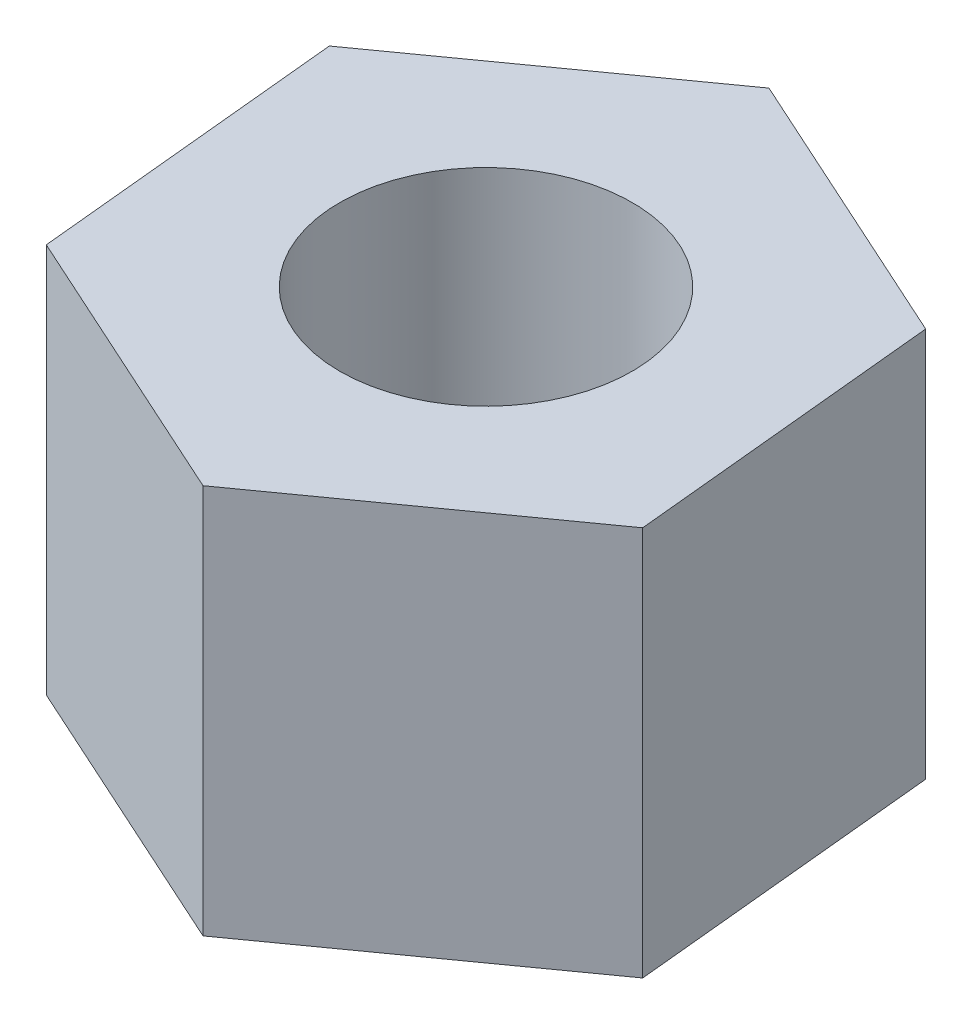
ISO-10303-21;
HEADER;
FILE_DESCRIPTION(('STEP AP214'),'2;1');
FILE_NAME('part.step','',(''),(''),'','','');
FILE_SCHEMA(('AUTOMOTIVE_DESIGN { 1 0 10303 214 1 1 1 1 }'));
ENDSEC;
DATA;
#1=APPLICATION_CONTEXT('core data for automotive mechanical design processes');
#2=APPLICATION_PROTOCOL_DEFINITION('international standard','automotive_design',2000,#1);
#3=PRODUCT_CONTEXT('',#1,'mechanical');
#4=PRODUCT('Part','Part','',(#3));
#5=PRODUCT_RELATED_PRODUCT_CATEGORY('part','',(#4));
#6=PRODUCT_DEFINITION_FORMATION('','',#4);
#7=PRODUCT_DEFINITION_CONTEXT('part definition',#1,'design');
#8=PRODUCT_DEFINITION('design','',#6,#7);
#9=PRODUCT_DEFINITION_SHAPE('','',#8);
#10=(LENGTH_UNIT() NAMED_UNIT(*) SI_UNIT(.MILLI.,.METRE.));
#11=(NAMED_UNIT(*) PLANE_ANGLE_UNIT() SI_UNIT($,.RADIAN.));
#12=(NAMED_UNIT(*) SI_UNIT($,.STERADIAN.) SOLID_ANGLE_UNIT());
#13=UNCERTAINTY_MEASURE_WITH_UNIT(LENGTH_MEASURE(1.E-05),#10,'distance_accuracy_value','');
#14=(GEOMETRIC_REPRESENTATION_CONTEXT(3) GLOBAL_UNCERTAINTY_ASSIGNED_CONTEXT((#13)) GLOBAL_UNIT_ASSIGNED_CONTEXT((#10,
#11,#12)) REPRESENTATION_CONTEXT('',''));
#15=CARTESIAN_POINT('',(0.,0.,0.));
#16=DIRECTION('',(0.,0.,1.));
#17=DIRECTION('',(1.,0.,0.));
#18=AXIS2_PLACEMENT_3D('',#15,#16,#17);
#19=CARTESIAN_POINT('',(0.,4.,0.));
#20=DIRECTION('',(0.,1.,0.));
#21=DIRECTION('',(0.,0.,1.));
#22=AXIS2_PLACEMENT_3D('',#19,#20,#21);
#23=PLANE('',#22);
#24=DIRECTION('',(0.813258701735184,0.,-0.581902297685791));
#25=VECTOR('',#24,1.);
#26=CARTESIAN_POINT('',(0.314628068490895,4.,3.21781641984918));
#27=LINE('',#26,#25);
#28=CARTESIAN_POINT('',(0.314628068490895,4.,3.21781641984918));
#29=VERTEX_POINT('',#28);
#30=CARTESIAN_POINT('',(2.94402479854953,4.,1.33643230986785));
#31=VERTEX_POINT('',#30);
#32=EDGE_CURVE('E137',#29,#31,#27,.T.);
#33=ORIENTED_EDGE('',*,*,#32,.T.);
#34=DIRECTION('',(-0.0973128214488377,0.,-0.995253844394317));
#35=VECTOR('',#34,1.);
#36=CARTESIAN_POINT('',(2.94402479854953,4.,1.33643230986785));
#37=LINE('',#36,#35);
#38=CARTESIAN_POINT('',(2.62939673005864,4.,-1.88138410998134));
#39=VERTEX_POINT('',#38);
#40=EDGE_CURVE('E95',#31,#39,#37,.T.);
#41=ORIENTED_EDGE('',*,*,#40,.T.);
#42=DIRECTION('',(-0.910571523184022,0.,-0.413351546708526));
#43=VECTOR('',#42,1.);
#44=CARTESIAN_POINT('',(2.62939673005864,4.,-1.88138410998134));
#45=LINE('',#44,#43);
#46=CARTESIAN_POINT('',(-0.314628068490895,4.,-3.21781641984919));
#47=VERTEX_POINT('',#46);
#48=EDGE_CURVE('E108',#39,#47,#45,.T.);
#49=ORIENTED_EDGE('',*,*,#48,.T.);
#50=DIRECTION('',(-0.813258701735184,0.,0.581902297685791));
#51=VECTOR('',#50,1.);
#52=CARTESIAN_POINT('',(-0.314628068490895,4.,-3.21781641984919));
#53=LINE('',#52,#51);
#54=CARTESIAN_POINT('',(-2.94402479854953,4.,-1.33643230986785));
#55=VERTEX_POINT('',#54);
#56=EDGE_CURVE('E102',#47,#55,#53,.T.);
#57=ORIENTED_EDGE('',*,*,#56,.T.);
#58=DIRECTION('',(0.0973128214488376,0.,0.995253844394317));
#59=VECTOR('',#58,1.);
#60=CARTESIAN_POINT('',(-2.94402479854953,4.,-1.33643230986785));
#61=LINE('',#60,#59);
#62=CARTESIAN_POINT('',(-2.62939673005864,4.,1.88138410998134));
#63=VERTEX_POINT('',#62);
#64=EDGE_CURVE('E106',#55,#63,#61,.T.);
#65=ORIENTED_EDGE('',*,*,#64,.T.);
#66=DIRECTION('',(0.910571523184022,0.,0.413351546708526));
#67=VECTOR('',#66,1.);
#68=CARTESIAN_POINT('',(-2.62939673005864,4.,1.88138410998134));
#69=LINE('',#68,#67);
#70=EDGE_CURVE('E58',#63,#29,#69,.T.);
#71=ORIENTED_EDGE('',*,*,#70,.T.);
#72=EDGE_LOOP('',(#33,#41,#49,#57,#65,#71));
#73=FACE_BOUND('',#72,.T.);
#74=CARTESIAN_POINT('',(0.,4.,0.));
#75=DIRECTION('',(0.,1.,0.));
#76=DIRECTION('',(0.,0.,1.));
#77=AXIS2_PLACEMENT_3D('',#74,#75,#76);
#78=CIRCLE('',#77,1.5);
#79=CARTESIAN_POINT('',(0.,4.,1.5));
#80=VERTEX_POINT('',#79);
#81=EDGE_CURVE('E130',#80,#80,#78,.T.);
#82=ORIENTED_EDGE('',*,*,#81,.F.);
#83=EDGE_LOOP('',(#82));
#84=FACE_BOUND('',#83,.T.);
#85=ADVANCED_FACE('F41',(#73,#84),#23,.T.);
#86=CARTESIAN_POINT('',(0.,0.,0.));
#87=DIRECTION('',(0.,1.,0.));
#88=DIRECTION('',(0.,0.,1.));
#89=AXIS2_PLACEMENT_3D('',#86,#87,#88);
#90=PLANE('',#89);
#91=DIRECTION('',(0.813258701735184,0.,-0.581902297685791));
#92=VECTOR('',#91,1.);
#93=CARTESIAN_POINT('',(0.314628068490895,0.,3.21781641984918));
#94=LINE('',#93,#92);
#95=CARTESIAN_POINT('',(0.314628068490895,0.,3.21781641984918));
#96=VERTEX_POINT('',#95);
#97=CARTESIAN_POINT('',(2.94402479854953,0.,1.33643230986785));
#98=VERTEX_POINT('',#97);
#99=EDGE_CURVE('E126',#96,#98,#94,.T.);
#100=ORIENTED_EDGE('',*,*,#99,.F.);
#101=DIRECTION('',(0.910571523184022,0.,0.413351546708526));
#102=VECTOR('',#101,1.);
#103=CARTESIAN_POINT('',(-2.62939673005864,0.,1.88138410998134));
#104=LINE('',#103,#102);
#105=CARTESIAN_POINT('',(-2.62939673005864,0.,1.88138410998134));
#106=VERTEX_POINT('',#105);
#107=EDGE_CURVE('E87',#106,#96,#104,.T.);
#108=ORIENTED_EDGE('',*,*,#107,.F.);
#109=DIRECTION('',(0.0973128214488376,0.,0.995253844394317));
#110=VECTOR('',#109,1.);
#111=CARTESIAN_POINT('',(-2.94402479854953,0.,-1.33643230986785));
#112=LINE('',#111,#110);
#113=CARTESIAN_POINT('',(-2.94402479854953,0.,-1.33643230986785));
#114=VERTEX_POINT('',#113);
#115=EDGE_CURVE('E81',#114,#106,#112,.T.);
#116=ORIENTED_EDGE('',*,*,#115,.F.);
#117=DIRECTION('',(-0.813258701735184,0.,0.581902297685791));
#118=VECTOR('',#117,1.);
#119=CARTESIAN_POINT('',(-0.314628068490895,0.,-3.21781641984919));
#120=LINE('',#119,#118);
#121=CARTESIAN_POINT('',(-0.314628068490895,0.,-3.21781641984919));
#122=VERTEX_POINT('',#121);
#123=EDGE_CURVE('E116',#122,#114,#120,.T.);
#124=ORIENTED_EDGE('',*,*,#123,.F.);
#125=DIRECTION('',(-0.910571523184022,0.,-0.413351546708526));
#126=VECTOR('',#125,1.);
#127=CARTESIAN_POINT('',(2.62939673005864,0.,-1.88138410998134));
#128=LINE('',#127,#126);
#129=CARTESIAN_POINT('',(2.62939673005864,0.,-1.88138410998134));
#130=VERTEX_POINT('',#129);
#131=EDGE_CURVE('E132',#130,#122,#128,.T.);
#132=ORIENTED_EDGE('',*,*,#131,.F.);
#133=DIRECTION('',(-0.0973128214488377,0.,-0.995253844394317));
#134=VECTOR('',#133,1.);
#135=CARTESIAN_POINT('',(2.94402479854953,0.,1.33643230986785));
#136=LINE('',#135,#134);
#137=EDGE_CURVE('E129',#98,#130,#136,.T.);
#138=ORIENTED_EDGE('',*,*,#137,.F.);
#139=EDGE_LOOP('',(#100,#108,#116,#124,#132,#138));
#140=FACE_BOUND('',#139,.T.);
#141=CARTESIAN_POINT('',(0.,0.,0.));
#142=DIRECTION('',(0.,1.,0.));
#143=DIRECTION('',(0.,0.,1.));
#144=AXIS2_PLACEMENT_3D('',#141,#142,#143);
#145=CIRCLE('',#144,1.5);
#146=CARTESIAN_POINT('',(0.,0.,1.5));
#147=VERTEX_POINT('',#146);
#148=EDGE_CURVE('E230',#147,#147,#145,.T.);
#149=ORIENTED_EDGE('',*,*,#148,.T.);
#150=EDGE_LOOP('',(#149));
#151=FACE_BOUND('',#150,.T.);
#152=ADVANCED_FACE('F146',(#140,#151),#90,.F.);
#153=CARTESIAN_POINT('',(0.314628068490895,4.,3.21781641984918));
#154=DIRECTION('',(-0.581902297685791,0.,-0.813258701735184));
#155=DIRECTION('',(-0.813258701735184,0.,0.581902297685791));
#156=AXIS2_PLACEMENT_3D('',#153,#154,#155);
#157=PLANE('',#156);
#158=ORIENTED_EDGE('',*,*,#99,.T.);
#159=DIRECTION('',(0.,-1.,0.));
#160=VECTOR('',#159,1.);
#161=CARTESIAN_POINT('',(2.94402479854953,4.,1.33643230986785));
#162=LINE('',#161,#160);
#163=EDGE_CURVE('E11',#31,#98,#162,.T.);
#164=ORIENTED_EDGE('',*,*,#163,.F.);
#165=ORIENTED_EDGE('',*,*,#32,.F.);
#166=DIRECTION('',(0.,-1.,0.));
#167=VECTOR('',#166,1.);
#168=CARTESIAN_POINT('',(0.314628068490895,4.,3.21781641984918));
#169=LINE('',#168,#167);
#170=EDGE_CURVE('E122',#29,#96,#169,.T.);
#171=ORIENTED_EDGE('',*,*,#170,.T.);
#172=EDGE_LOOP('',(#158,#164,#165,#171));
#173=FACE_BOUND('',#172,.T.);
#174=ADVANCED_FACE('F43',(#173),#157,.F.);
#175=CARTESIAN_POINT('',(2.94402479854953,4.,1.33643230986785));
#176=DIRECTION('',(-0.995253844394317,0.,0.0973128214488377));
#177=DIRECTION('',(0.0973128214488377,0.,0.995253844394317));
#178=AXIS2_PLACEMENT_3D('',#175,#176,#177);
#179=PLANE('',#178);
#180=ORIENTED_EDGE('',*,*,#137,.T.);
#181=DIRECTION('',(0.,-1.,0.));
#182=VECTOR('',#181,1.);
#183=CARTESIAN_POINT('',(2.62939673005864,4.,-1.88138410998134));
#184=LINE('',#183,#182);
#185=EDGE_CURVE('E50',#39,#130,#184,.T.);
#186=ORIENTED_EDGE('',*,*,#185,.F.);
#187=ORIENTED_EDGE('',*,*,#40,.F.);
#188=ORIENTED_EDGE('',*,*,#163,.T.);
#189=EDGE_LOOP('',(#180,#186,#187,#188));
#190=FACE_BOUND('',#189,.T.);
#191=ADVANCED_FACE('F171',(#190),#179,.F.);
#192=CARTESIAN_POINT('',(2.62939673005864,4.,-1.88138410998134));
#193=DIRECTION('',(-0.413351546708526,0.,0.910571523184022));
#194=DIRECTION('',(0.910571523184022,0.,0.413351546708526));
#195=AXIS2_PLACEMENT_3D('',#192,#193,#194);
#196=PLANE('',#195);
#197=ORIENTED_EDGE('',*,*,#131,.T.);
#198=DIRECTION('',(0.,-1.,0.));
#199=VECTOR('',#198,1.);
#200=CARTESIAN_POINT('',(-0.314628068490895,4.,-3.21781641984919));
#201=LINE('',#200,#199);
#202=EDGE_CURVE('E117',#47,#122,#201,.T.);
#203=ORIENTED_EDGE('',*,*,#202,.F.);
#204=ORIENTED_EDGE('',*,*,#48,.F.);
#205=ORIENTED_EDGE('',*,*,#185,.T.);
#206=EDGE_LOOP('',(#197,#203,#204,#205));
#207=FACE_BOUND('',#206,.T.);
#208=ADVANCED_FACE('F143',(#207),#196,.F.);
#209=CARTESIAN_POINT('',(-0.314628068490895,4.,-3.21781641984919));
#210=DIRECTION('',(0.581902297685791,0.,0.813258701735184));
#211=DIRECTION('',(0.813258701735184,0.,-0.581902297685791));
#212=AXIS2_PLACEMENT_3D('',#209,#210,#211);
#213=PLANE('',#212);
#214=ORIENTED_EDGE('',*,*,#123,.T.);
#215=DIRECTION('',(0.,-1.,0.));
#216=VECTOR('',#215,1.);
#217=CARTESIAN_POINT('',(-2.94402479854953,4.,-1.33643230986785));
#218=LINE('',#217,#216);
#219=EDGE_CURVE('E113',#55,#114,#218,.T.);
#220=ORIENTED_EDGE('',*,*,#219,.F.);
#221=ORIENTED_EDGE('',*,*,#56,.F.);
#222=ORIENTED_EDGE('',*,*,#202,.T.);
#223=EDGE_LOOP('',(#214,#220,#221,#222));
#224=FACE_BOUND('',#223,.T.);
#225=ADVANCED_FACE('F114',(#224),#213,.F.);
#226=CARTESIAN_POINT('',(-2.94402479854953,4.,-1.33643230986785));
#227=DIRECTION('',(0.995253844394317,0.,-0.0973128214488376));
#228=DIRECTION('',(-0.0973128214488376,0.,-0.995253844394317));
#229=AXIS2_PLACEMENT_3D('',#226,#227,#228);
#230=PLANE('',#229);
#231=ORIENTED_EDGE('',*,*,#115,.T.);
#232=DIRECTION('',(0.,-1.,0.));
#233=VECTOR('',#232,1.);
#234=CARTESIAN_POINT('',(-2.62939673005864,4.,1.88138410998134));
#235=LINE('',#234,#233);
#236=EDGE_CURVE('E118',#63,#106,#235,.T.);
#237=ORIENTED_EDGE('',*,*,#236,.F.);
#238=ORIENTED_EDGE('',*,*,#64,.F.);
#239=ORIENTED_EDGE('',*,*,#219,.T.);
#240=EDGE_LOOP('',(#231,#237,#238,#239));
#241=FACE_BOUND('',#240,.T.);
#242=ADVANCED_FACE('F120',(#241),#230,.F.);
#243=CARTESIAN_POINT('',(-2.62939673005864,4.,1.88138410998134));
#244=DIRECTION('',(0.413351546708526,0.,-0.910571523184022));
#245=DIRECTION('',(-0.910571523184022,0.,-0.413351546708526));
#246=AXIS2_PLACEMENT_3D('',#243,#244,#245);
#247=PLANE('',#246);
#248=ORIENTED_EDGE('',*,*,#107,.T.);
#249=ORIENTED_EDGE('',*,*,#170,.F.);
#250=ORIENTED_EDGE('',*,*,#70,.F.);
#251=ORIENTED_EDGE('',*,*,#236,.T.);
#252=EDGE_LOOP('',(#248,#249,#250,#251));
#253=FACE_BOUND('',#252,.T.);
#254=ADVANCED_FACE('F151',(#253),#247,.F.);
#255=CARTESIAN_POINT('',(0.,4.,0.));
#256=DIRECTION('',(0.,-1.,0.));
#257=DIRECTION('',(0.,0.,-1.));
#258=AXIS2_PLACEMENT_3D('',#255,#256,#257);
#259=CYLINDRICAL_SURFACE('',#258,1.5);
#260=ORIENTED_EDGE('',*,*,#81,.T.);
#261=EDGE_LOOP('',(#260));
#262=FACE_BOUND('',#261,.T.);
#263=ORIENTED_EDGE('',*,*,#148,.F.);
#264=EDGE_LOOP('',(#263));
#265=FACE_BOUND('',#264,.T.);
#266=ADVANCED_FACE('F153',(#262,#265),#259,.F.);
#267=CLOSED_SHELL('',(#85,#152,#174,#191,#208,#225,#242,#254,#266));
#268=MANIFOLD_SOLID_BREP('B2',#267);
#269=ADVANCED_BREP_SHAPE_REPRESENTATION('',(#18,#268),#14);
#270=SHAPE_DEFINITION_REPRESENTATION(#9,#269);
ENDSEC;
END-ISO-10303-21;
